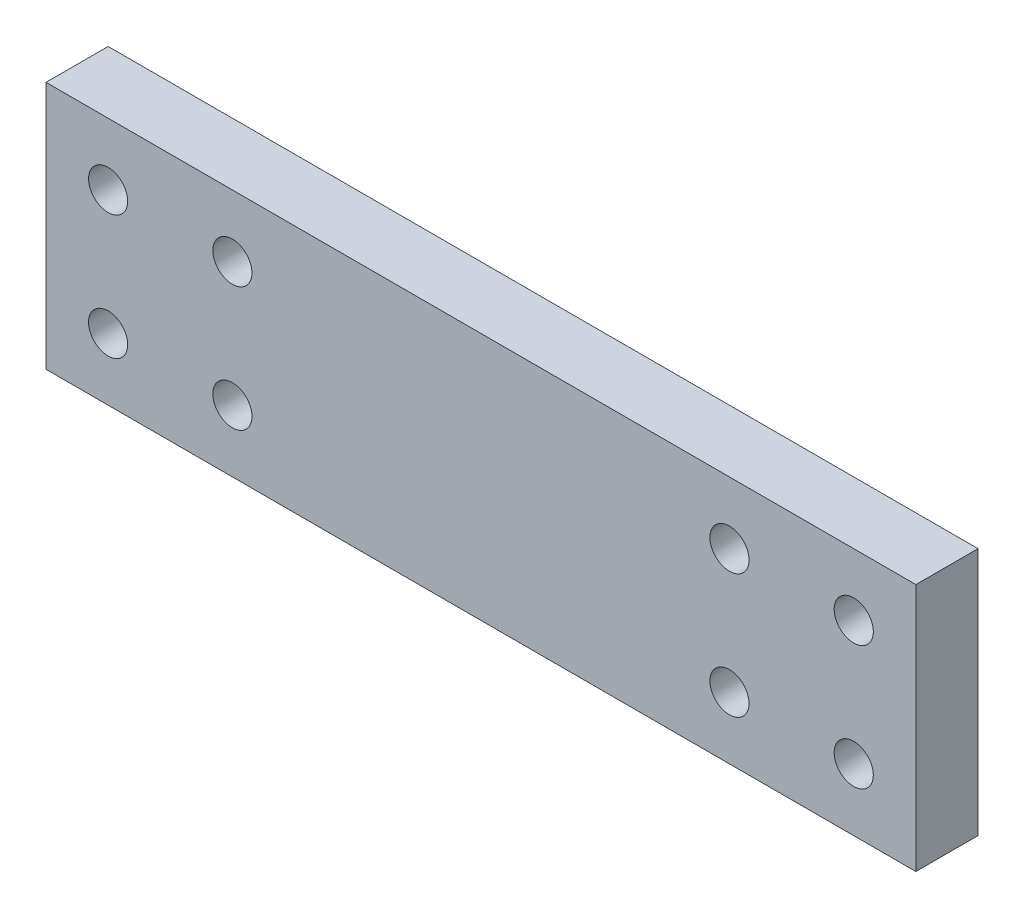
ISO-10303-21;
HEADER;
FILE_DESCRIPTION(('STEP AP214'),'2;1');
FILE_NAME('part.step','',(''),(''),'','','');
FILE_SCHEMA(('AUTOMOTIVE_DESIGN { 1 0 10303 214 1 1 1 1 }'));
ENDSEC;
DATA;
#1=APPLICATION_CONTEXT('core data for automotive mechanical design processes');
#2=APPLICATION_PROTOCOL_DEFINITION('international standard','automotive_design',2000,#1);
#3=PRODUCT_CONTEXT('',#1,'mechanical');
#4=PRODUCT('Part','Part','',(#3));
#5=PRODUCT_RELATED_PRODUCT_CATEGORY('part','',(#4));
#6=PRODUCT_DEFINITION_FORMATION('','',#4);
#7=PRODUCT_DEFINITION_CONTEXT('part definition',#1,'design');
#8=PRODUCT_DEFINITION('design','',#6,#7);
#9=PRODUCT_DEFINITION_SHAPE('','',#8);
#10=(LENGTH_UNIT() NAMED_UNIT(*) SI_UNIT(.MILLI.,.METRE.));
#11=(NAMED_UNIT(*) PLANE_ANGLE_UNIT() SI_UNIT($,.RADIAN.));
#12=(NAMED_UNIT(*) SI_UNIT($,.STERADIAN.) SOLID_ANGLE_UNIT());
#13=UNCERTAINTY_MEASURE_WITH_UNIT(LENGTH_MEASURE(1.E-05),#10,'distance_accuracy_value','');
#14=(GEOMETRIC_REPRESENTATION_CONTEXT(3) GLOBAL_UNCERTAINTY_ASSIGNED_CONTEXT((#13)) GLOBAL_UNIT_ASSIGNED_CONTEXT((#10,
#11,#12)) REPRESENTATION_CONTEXT('',''));
#15=CARTESIAN_POINT('',(0.,0.,0.));
#16=DIRECTION('',(0.,0.,1.));
#17=DIRECTION('',(1.,0.,0.));
#18=AXIS2_PLACEMENT_3D('',#15,#16,#17);
#19=CARTESIAN_POINT('',(0.,0.,5.));
#20=DIRECTION('',(1.,0.,0.));
#21=DIRECTION('',(0.,1.,0.));
#22=AXIS2_PLACEMENT_3D('',#19,#20,#21);
#23=PLANE('',#22);
#24=DIRECTION('',(0.,-1.,0.));
#25=VECTOR('',#24,1.);
#26=CARTESIAN_POINT('',(0.,0.,0.));
#27=LINE('',#26,#25);
#28=CARTESIAN_POINT('',(0.,0.,0.));
#29=VERTEX_POINT('',#28);
#30=CARTESIAN_POINT('',(0.,-20.,0.));
#31=VERTEX_POINT('',#30);
#32=EDGE_CURVE('E111',#29,#31,#27,.T.);
#33=ORIENTED_EDGE('',*,*,#32,.T.);
#34=DIRECTION('',(0.,0.,-1.));
#35=VECTOR('',#34,1.);
#36=CARTESIAN_POINT('',(0.,-20.,5.));
#37=LINE('',#36,#35);
#38=CARTESIAN_POINT('',(0.,-20.,5.));
#39=VERTEX_POINT('',#38);
#40=EDGE_CURVE('E11',#39,#31,#37,.T.);
#41=ORIENTED_EDGE('',*,*,#40,.F.);
#42=DIRECTION('',(0.,-1.,0.));
#43=VECTOR('',#42,1.);
#44=CARTESIAN_POINT('',(0.,0.,5.));
#45=LINE('',#44,#43);
#46=CARTESIAN_POINT('',(0.,0.,5.));
#47=VERTEX_POINT('',#46);
#48=EDGE_CURVE('E95',#47,#39,#45,.T.);
#49=ORIENTED_EDGE('',*,*,#48,.F.);
#50=DIRECTION('',(0.,0.,-1.));
#51=VECTOR('',#50,1.);
#52=CARTESIAN_POINT('',(0.,0.,5.));
#53=LINE('',#52,#51);
#54=EDGE_CURVE('E107',#47,#29,#53,.T.);
#55=ORIENTED_EDGE('',*,*,#54,.T.);
#56=EDGE_LOOP('',(#33,#41,#49,#55));
#57=FACE_BOUND('',#56,.T.);
#58=ADVANCED_FACE('F43',(#57),#23,.F.);
#59=CARTESIAN_POINT('',(0.,-20.,5.));
#60=DIRECTION('',(0.,1.,0.));
#61=DIRECTION('',(-1.,0.,0.));
#62=AXIS2_PLACEMENT_3D('',#59,#60,#61);
#63=PLANE('',#62);
#64=DIRECTION('',(1.,0.,0.));
#65=VECTOR('',#64,1.);
#66=CARTESIAN_POINT('',(0.,-20.,0.));
#67=LINE('',#66,#65);
#68=CARTESIAN_POINT('',(70.,-20.,0.));
#69=VERTEX_POINT('',#68);
#70=EDGE_CURVE('E100',#31,#69,#67,.T.);
#71=ORIENTED_EDGE('',*,*,#70,.T.);
#72=DIRECTION('',(0.,0.,-1.));
#73=VECTOR('',#72,1.);
#74=CARTESIAN_POINT('',(70.,-20.,5.));
#75=LINE('',#74,#73);
#76=CARTESIAN_POINT('',(70.,-20.,5.));
#77=VERTEX_POINT('',#76);
#78=EDGE_CURVE('E52',#77,#69,#75,.T.);
#79=ORIENTED_EDGE('',*,*,#78,.F.);
#80=DIRECTION('',(1.,0.,0.));
#81=VECTOR('',#80,1.);
#82=CARTESIAN_POINT('',(0.,-20.,5.));
#83=LINE('',#82,#81);
#84=EDGE_CURVE('E90',#39,#77,#83,.T.);
#85=ORIENTED_EDGE('',*,*,#84,.F.);
#86=ORIENTED_EDGE('',*,*,#40,.T.);
#87=EDGE_LOOP('',(#71,#79,#85,#86));
#88=FACE_BOUND('',#87,.T.);
#89=ADVANCED_FACE('F99',(#88),#63,.F.);
#90=CARTESIAN_POINT('',(70.,0.,5.));
#91=DIRECTION('',(-1.,0.,0.));
#92=DIRECTION('',(0.,-1.,0.));
#93=AXIS2_PLACEMENT_3D('',#90,#91,#92);
#94=PLANE('',#93);
#95=DIRECTION('',(0.,1.,0.));
#96=VECTOR('',#95,1.);
#97=CARTESIAN_POINT('',(70.,0.,0.));
#98=LINE('',#97,#96);
#99=CARTESIAN_POINT('',(70.,0.,0.));
#100=VERTEX_POINT('',#99);
#101=EDGE_CURVE('E77',#69,#100,#98,.T.);
#102=ORIENTED_EDGE('',*,*,#101,.T.);
#103=DIRECTION('',(0.,0.,-1.));
#104=VECTOR('',#103,1.);
#105=CARTESIAN_POINT('',(70.,0.,5.));
#106=LINE('',#105,#104);
#107=CARTESIAN_POINT('',(70.,0.,5.));
#108=VERTEX_POINT('',#107);
#109=EDGE_CURVE('E102',#108,#100,#106,.T.);
#110=ORIENTED_EDGE('',*,*,#109,.F.);
#111=DIRECTION('',(0.,1.,0.));
#112=VECTOR('',#111,1.);
#113=CARTESIAN_POINT('',(70.,0.,5.));
#114=LINE('',#113,#112);
#115=EDGE_CURVE('E93',#77,#108,#114,.T.);
#116=ORIENTED_EDGE('',*,*,#115,.F.);
#117=ORIENTED_EDGE('',*,*,#78,.T.);
#118=EDGE_LOOP('',(#102,#110,#116,#117));
#119=FACE_BOUND('',#118,.T.);
#120=ADVANCED_FACE('F103',(#119),#94,.F.);
#121=CARTESIAN_POINT('',(0.,0.,5.));
#122=DIRECTION('',(0.,-1.,0.));
#123=DIRECTION('',(0.,0.,-1.));
#124=AXIS2_PLACEMENT_3D('',#121,#122,#123);
#125=PLANE('',#124);
#126=DIRECTION('',(-1.,0.,0.));
#127=VECTOR('',#126,1.);
#128=CARTESIAN_POINT('',(0.,0.,0.));
#129=LINE('',#128,#127);
#130=EDGE_CURVE('E83',#100,#29,#129,.T.);
#131=ORIENTED_EDGE('',*,*,#130,.T.);
#132=ORIENTED_EDGE('',*,*,#54,.F.);
#133=DIRECTION('',(-1.,0.,0.));
#134=VECTOR('',#133,1.);
#135=CARTESIAN_POINT('',(0.,0.,5.));
#136=LINE('',#135,#134);
#137=EDGE_CURVE('E60',#108,#47,#136,.T.);
#138=ORIENTED_EDGE('',*,*,#137,.F.);
#139=ORIENTED_EDGE('',*,*,#109,.T.);
#140=EDGE_LOOP('',(#131,#132,#138,#139));
#141=FACE_BOUND('',#140,.T.);
#142=ADVANCED_FACE('F125',(#141),#125,.F.);
#143=CARTESIAN_POINT('',(0.,0.,5.));
#144=DIRECTION('',(0.,0.,1.));
#145=DIRECTION('',(1.,0.,0.));
#146=AXIS2_PLACEMENT_3D('',#143,#144,#145);
#147=PLANE('',#146);
#148=CARTESIAN_POINT('',(5.,-15.,5.));
#149=DIRECTION('',(0.,0.,1.));
#150=DIRECTION('',(-1.,0.,0.));
#151=AXIS2_PLACEMENT_3D('',#148,#149,#150);
#152=CIRCLE('',#151,1.575);
#153=CARTESIAN_POINT('',(3.425,-15.,5.));
#154=VERTEX_POINT('',#153);
#155=EDGE_CURVE('E136',#154,#154,#152,.T.);
#156=ORIENTED_EDGE('',*,*,#155,.F.);
#157=EDGE_LOOP('',(#156));
#158=FACE_BOUND('',#157,.T.);
#159=CARTESIAN_POINT('',(15.,-15.,5.));
#160=DIRECTION('',(0.,0.,1.));
#161=DIRECTION('',(1.,0.,0.));
#162=AXIS2_PLACEMENT_3D('',#159,#160,#161);
#163=CIRCLE('',#162,1.575);
#164=CARTESIAN_POINT('',(16.575,-15.,5.));
#165=VERTEX_POINT('',#164);
#166=EDGE_CURVE('E161',#165,#165,#163,.T.);
#167=ORIENTED_EDGE('',*,*,#166,.F.);
#168=EDGE_LOOP('',(#167));
#169=FACE_BOUND('',#168,.T.);
#170=CARTESIAN_POINT('',(15.,-5.,5.));
#171=DIRECTION('',(0.,0.,1.));
#172=DIRECTION('',(-1.,0.,0.));
#173=AXIS2_PLACEMENT_3D('',#170,#171,#172);
#174=CIRCLE('',#173,1.575);
#175=CARTESIAN_POINT('',(13.425,-5.,5.));
#176=VERTEX_POINT('',#175);
#177=EDGE_CURVE('E153',#176,#176,#174,.T.);
#178=ORIENTED_EDGE('',*,*,#177,.F.);
#179=EDGE_LOOP('',(#178));
#180=FACE_BOUND('',#179,.T.);
#181=CARTESIAN_POINT('',(55.,-5.,5.));
#182=DIRECTION('',(0.,0.,1.));
#183=DIRECTION('',(1.,0.,0.));
#184=AXIS2_PLACEMENT_3D('',#181,#182,#183);
#185=CIRCLE('',#184,1.57499999999999);
#186=CARTESIAN_POINT('',(56.575,-5.,5.));
#187=VERTEX_POINT('',#186);
#188=EDGE_CURVE('E144',#187,#187,#185,.T.);
#189=ORIENTED_EDGE('',*,*,#188,.F.);
#190=EDGE_LOOP('',(#189));
#191=FACE_BOUND('',#190,.T.);
#192=CARTESIAN_POINT('',(55.,-15.,5.));
#193=DIRECTION('',(0.,0.,1.));
#194=DIRECTION('',(-1.,0.,0.));
#195=AXIS2_PLACEMENT_3D('',#192,#193,#194);
#196=CIRCLE('',#195,1.575);
#197=CARTESIAN_POINT('',(53.425,-15.,5.));
#198=VERTEX_POINT('',#197);
#199=EDGE_CURVE('E145',#198,#198,#196,.T.);
#200=ORIENTED_EDGE('',*,*,#199,.F.);
#201=EDGE_LOOP('',(#200));
#202=FACE_BOUND('',#201,.T.);
#203=CARTESIAN_POINT('',(65.,-15.,5.));
#204=DIRECTION('',(0.,0.,1.));
#205=DIRECTION('',(1.,0.,0.));
#206=AXIS2_PLACEMENT_3D('',#203,#204,#205);
#207=CIRCLE('',#206,1.57500000000001);
#208=CARTESIAN_POINT('',(66.575,-15.,5.));
#209=VERTEX_POINT('',#208);
#210=EDGE_CURVE('E184',#209,#209,#207,.T.);
#211=ORIENTED_EDGE('',*,*,#210,.F.);
#212=EDGE_LOOP('',(#211));
#213=FACE_BOUND('',#212,.T.);
#214=CARTESIAN_POINT('',(65.,-5.,5.));
#215=DIRECTION('',(0.,0.,1.));
#216=DIRECTION('',(-1.,0.,0.));
#217=AXIS2_PLACEMENT_3D('',#214,#215,#216);
#218=CIRCLE('',#217,1.57499999999999);
#219=CARTESIAN_POINT('',(63.425,-5.,5.));
#220=VERTEX_POINT('',#219);
#221=EDGE_CURVE('E176',#220,#220,#218,.T.);
#222=ORIENTED_EDGE('',*,*,#221,.F.);
#223=EDGE_LOOP('',(#222));
#224=FACE_BOUND('',#223,.T.);
#225=CARTESIAN_POINT('',(5.,-5.,5.));
#226=DIRECTION('',(0.,0.,1.));
#227=DIRECTION('',(1.,0.,0.));
#228=AXIS2_PLACEMENT_3D('',#225,#226,#227);
#229=CIRCLE('',#228,1.575);
#230=CARTESIAN_POINT('',(6.575,-5.,5.));
#231=VERTEX_POINT('',#230);
#232=EDGE_CURVE('E132',#231,#231,#229,.T.);
#233=ORIENTED_EDGE('',*,*,#232,.F.);
#234=EDGE_LOOP('',(#233));
#235=FACE_BOUND('',#234,.T.);
#236=ORIENTED_EDGE('',*,*,#48,.T.);
#237=ORIENTED_EDGE('',*,*,#84,.T.);
#238=ORIENTED_EDGE('',*,*,#115,.T.);
#239=ORIENTED_EDGE('',*,*,#137,.T.);
#240=EDGE_LOOP('',(#236,#237,#238,#239));
#241=FACE_BOUND('',#240,.T.);
#242=ADVANCED_FACE('F91',(#158,#169,#180,#191,#202,#213,#224,#235,#241),#147,.T.);
#243=CARTESIAN_POINT('',(0.,0.,0.));
#244=DIRECTION('',(0.,0.,1.));
#245=DIRECTION('',(1.,0.,0.));
#246=AXIS2_PLACEMENT_3D('',#243,#244,#245);
#247=PLANE('',#246);
#248=CARTESIAN_POINT('',(5.,-15.,0.));
#249=DIRECTION('',(0.,0.,1.));
#250=DIRECTION('',(-1.,0.,0.));
#251=AXIS2_PLACEMENT_3D('',#248,#249,#250);
#252=CIRCLE('',#251,1.575);
#253=CARTESIAN_POINT('',(3.425,-15.,0.));
#254=VERTEX_POINT('',#253);
#255=EDGE_CURVE('E165',#254,#254,#252,.T.);
#256=ORIENTED_EDGE('',*,*,#255,.T.);
#257=EDGE_LOOP('',(#256));
#258=FACE_BOUND('',#257,.T.);
#259=CARTESIAN_POINT('',(15.,-15.,0.));
#260=DIRECTION('',(0.,0.,1.));
#261=DIRECTION('',(1.,0.,0.));
#262=AXIS2_PLACEMENT_3D('',#259,#260,#261);
#263=CIRCLE('',#262,1.575);
#264=CARTESIAN_POINT('',(16.575,-15.,0.));
#265=VERTEX_POINT('',#264);
#266=EDGE_CURVE('E157',#265,#265,#263,.T.);
#267=ORIENTED_EDGE('',*,*,#266,.T.);
#268=EDGE_LOOP('',(#267));
#269=FACE_BOUND('',#268,.T.);
#270=CARTESIAN_POINT('',(15.,-5.,0.));
#271=DIRECTION('',(0.,0.,1.));
#272=DIRECTION('',(-1.,0.,0.));
#273=AXIS2_PLACEMENT_3D('',#270,#271,#272);
#274=CIRCLE('',#273,1.575);
#275=CARTESIAN_POINT('',(13.425,-5.,0.));
#276=VERTEX_POINT('',#275);
#277=EDGE_CURVE('E149',#276,#276,#274,.T.);
#278=ORIENTED_EDGE('',*,*,#277,.T.);
#279=EDGE_LOOP('',(#278));
#280=FACE_BOUND('',#279,.T.);
#281=CARTESIAN_POINT('',(55.,-5.,0.));
#282=DIRECTION('',(0.,0.,1.));
#283=DIRECTION('',(1.,0.,0.));
#284=AXIS2_PLACEMENT_3D('',#281,#282,#283);
#285=CIRCLE('',#284,1.57499999999999);
#286=CARTESIAN_POINT('',(56.575,-5.,0.));
#287=VERTEX_POINT('',#286);
#288=EDGE_CURVE('E140',#287,#287,#285,.T.);
#289=ORIENTED_EDGE('',*,*,#288,.T.);
#290=EDGE_LOOP('',(#289));
#291=FACE_BOUND('',#290,.T.);
#292=CARTESIAN_POINT('',(55.,-15.,0.));
#293=DIRECTION('',(0.,0.,1.));
#294=DIRECTION('',(-1.,0.,0.));
#295=AXIS2_PLACEMENT_3D('',#292,#293,#294);
#296=CIRCLE('',#295,1.575);
#297=CARTESIAN_POINT('',(53.425,-15.,0.));
#298=VERTEX_POINT('',#297);
#299=EDGE_CURVE('E188',#298,#298,#296,.T.);
#300=ORIENTED_EDGE('',*,*,#299,.T.);
#301=EDGE_LOOP('',(#300));
#302=FACE_BOUND('',#301,.T.);
#303=CARTESIAN_POINT('',(65.,-15.,0.));
#304=DIRECTION('',(0.,0.,1.));
#305=DIRECTION('',(1.,0.,0.));
#306=AXIS2_PLACEMENT_3D('',#303,#304,#305);
#307=CIRCLE('',#306,1.57500000000001);
#308=CARTESIAN_POINT('',(66.575,-15.,0.));
#309=VERTEX_POINT('',#308);
#310=EDGE_CURVE('E180',#309,#309,#307,.T.);
#311=ORIENTED_EDGE('',*,*,#310,.T.);
#312=EDGE_LOOP('',(#311));
#313=FACE_BOUND('',#312,.T.);
#314=CARTESIAN_POINT('',(65.,-5.,0.));
#315=DIRECTION('',(0.,0.,1.));
#316=DIRECTION('',(-1.,0.,0.));
#317=AXIS2_PLACEMENT_3D('',#314,#315,#316);
#318=CIRCLE('',#317,1.57499999999999);
#319=CARTESIAN_POINT('',(63.425,-5.,0.));
#320=VERTEX_POINT('',#319);
#321=EDGE_CURVE('E172',#320,#320,#318,.T.);
#322=ORIENTED_EDGE('',*,*,#321,.T.);
#323=EDGE_LOOP('',(#322));
#324=FACE_BOUND('',#323,.T.);
#325=CARTESIAN_POINT('',(5.,-5.,0.));
#326=DIRECTION('',(0.,0.,1.));
#327=DIRECTION('',(1.,0.,0.));
#328=AXIS2_PLACEMENT_3D('',#325,#326,#327);
#329=CIRCLE('',#328,1.575);
#330=CARTESIAN_POINT('',(6.575,-5.,0.));
#331=VERTEX_POINT('',#330);
#332=EDGE_CURVE('E115',#331,#331,#329,.T.);
#333=ORIENTED_EDGE('',*,*,#332,.T.);
#334=EDGE_LOOP('',(#333));
#335=FACE_BOUND('',#334,.T.);
#336=ORIENTED_EDGE('',*,*,#32,.F.);
#337=ORIENTED_EDGE('',*,*,#130,.F.);
#338=ORIENTED_EDGE('',*,*,#101,.F.);
#339=ORIENTED_EDGE('',*,*,#70,.F.);
#340=EDGE_LOOP('',(#336,#337,#338,#339));
#341=FACE_BOUND('',#340,.T.);
#342=ADVANCED_FACE('F128',(#258,#269,#280,#291,#302,#313,#324,#335,#341),#247,.F.);
#343=CARTESIAN_POINT('',(5.,-5.,0.));
#344=DIRECTION('',(0.,0.,1.));
#345=DIRECTION('',(1.,0.,0.));
#346=AXIS2_PLACEMENT_3D('',#343,#344,#345);
#347=CYLINDRICAL_SURFACE('',#346,1.575);
#348=ORIENTED_EDGE('',*,*,#332,.F.);
#349=EDGE_LOOP('',(#348));
#350=FACE_BOUND('',#349,.T.);
#351=ORIENTED_EDGE('',*,*,#232,.T.);
#352=EDGE_LOOP('',(#351));
#353=FACE_BOUND('',#352,.T.);
#354=ADVANCED_FACE('F208',(#350,#353),#347,.F.);
#355=CARTESIAN_POINT('',(65.,-5.,0.));
#356=DIRECTION('',(0.,0.,1.));
#357=DIRECTION('',(1.,0.,0.));
#358=AXIS2_PLACEMENT_3D('',#355,#356,#357);
#359=CYLINDRICAL_SURFACE('',#358,1.57499999999999);
#360=ORIENTED_EDGE('',*,*,#321,.F.);
#361=EDGE_LOOP('',(#360));
#362=FACE_BOUND('',#361,.T.);
#363=ORIENTED_EDGE('',*,*,#221,.T.);
#364=EDGE_LOOP('',(#363));
#365=FACE_BOUND('',#364,.T.);
#366=ADVANCED_FACE('F210',(#362,#365),#359,.F.);
#367=CARTESIAN_POINT('',(65.,-15.,0.));
#368=DIRECTION('',(0.,0.,1.));
#369=DIRECTION('',(1.,0.,0.));
#370=AXIS2_PLACEMENT_3D('',#367,#368,#369);
#371=CYLINDRICAL_SURFACE('',#370,1.57500000000001);
#372=ORIENTED_EDGE('',*,*,#310,.F.);
#373=EDGE_LOOP('',(#372));
#374=FACE_BOUND('',#373,.T.);
#375=ORIENTED_EDGE('',*,*,#210,.T.);
#376=EDGE_LOOP('',(#375));
#377=FACE_BOUND('',#376,.T.);
#378=ADVANCED_FACE('F217',(#374,#377),#371,.F.);
#379=CARTESIAN_POINT('',(55.,-15.,0.));
#380=DIRECTION('',(0.,0.,1.));
#381=DIRECTION('',(1.,0.,0.));
#382=AXIS2_PLACEMENT_3D('',#379,#380,#381);
#383=CYLINDRICAL_SURFACE('',#382,1.575);
#384=ORIENTED_EDGE('',*,*,#299,.F.);
#385=EDGE_LOOP('',(#384));
#386=FACE_BOUND('',#385,.T.);
#387=ORIENTED_EDGE('',*,*,#199,.T.);
#388=EDGE_LOOP('',(#387));
#389=FACE_BOUND('',#388,.T.);
#390=ADVANCED_FACE('F196',(#386,#389),#383,.F.);
#391=CARTESIAN_POINT('',(55.,-5.,0.));
#392=DIRECTION('',(0.,0.,1.));
#393=DIRECTION('',(1.,0.,0.));
#394=AXIS2_PLACEMENT_3D('',#391,#392,#393);
#395=CYLINDRICAL_SURFACE('',#394,1.57499999999999);
#396=ORIENTED_EDGE('',*,*,#288,.F.);
#397=EDGE_LOOP('',(#396));
#398=FACE_BOUND('',#397,.T.);
#399=ORIENTED_EDGE('',*,*,#188,.T.);
#400=EDGE_LOOP('',(#399));
#401=FACE_BOUND('',#400,.T.);
#402=ADVANCED_FACE('F278',(#398,#401),#395,.F.);
#403=CARTESIAN_POINT('',(15.,-5.,0.));
#404=DIRECTION('',(0.,0.,1.));
#405=DIRECTION('',(1.,0.,0.));
#406=AXIS2_PLACEMENT_3D('',#403,#404,#405);
#407=CYLINDRICAL_SURFACE('',#406,1.575);
#408=ORIENTED_EDGE('',*,*,#277,.F.);
#409=EDGE_LOOP('',(#408));
#410=FACE_BOUND('',#409,.T.);
#411=ORIENTED_EDGE('',*,*,#177,.T.);
#412=EDGE_LOOP('',(#411));
#413=FACE_BOUND('',#412,.T.);
#414=ADVANCED_FACE('F289',(#410,#413),#407,.F.);
#415=CARTESIAN_POINT('',(15.,-15.,0.));
#416=DIRECTION('',(0.,0.,1.));
#417=DIRECTION('',(1.,0.,0.));
#418=AXIS2_PLACEMENT_3D('',#415,#416,#417);
#419=CYLINDRICAL_SURFACE('',#418,1.575);
#420=ORIENTED_EDGE('',*,*,#266,.F.);
#421=EDGE_LOOP('',(#420));
#422=FACE_BOUND('',#421,.T.);
#423=ORIENTED_EDGE('',*,*,#166,.T.);
#424=EDGE_LOOP('',(#423));
#425=FACE_BOUND('',#424,.T.);
#426=ADVANCED_FACE('F299',(#422,#425),#419,.F.);
#427=CARTESIAN_POINT('',(5.,-15.,0.));
#428=DIRECTION('',(0.,0.,1.));
#429=DIRECTION('',(1.,0.,0.));
#430=AXIS2_PLACEMENT_3D('',#427,#428,#429);
#431=CYLINDRICAL_SURFACE('',#430,1.575);
#432=ORIENTED_EDGE('',*,*,#255,.F.);
#433=EDGE_LOOP('',(#432));
#434=FACE_BOUND('',#433,.T.);
#435=ORIENTED_EDGE('',*,*,#155,.T.);
#436=EDGE_LOOP('',(#435));
#437=FACE_BOUND('',#436,.T.);
#438=ADVANCED_FACE('F310',(#434,#437),#431,.F.);
#439=CLOSED_SHELL('',(#58,#89,#120,#142,#242,#342,#354,#366,#378,#390,#402,#414,#426,#438));
#440=MANIFOLD_SOLID_BREP('B2',#439);
#441=ADVANCED_BREP_SHAPE_REPRESENTATION('',(#18,#440),#14);
#442=SHAPE_DEFINITION_REPRESENTATION(#9,#441);
ENDSEC;
END-ISO-10303-21;
